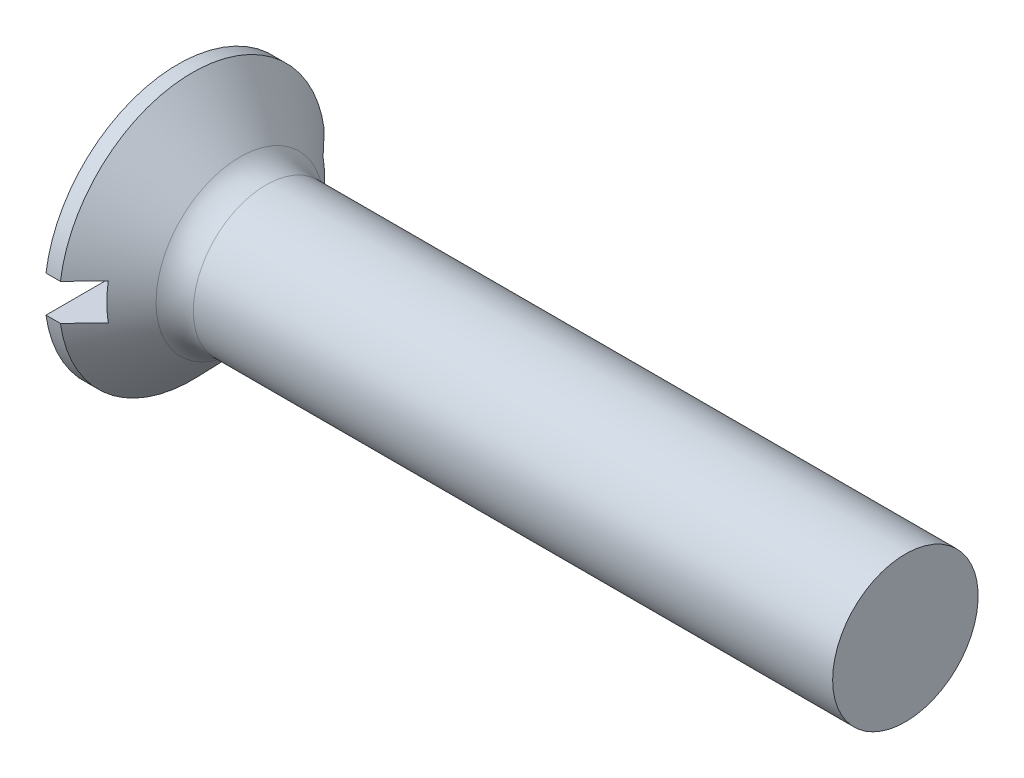
ISO-10303-21;
HEADER;
FILE_DESCRIPTION(('STEP AP214'),'2;1');
FILE_NAME('part.step','',(''),(''),'','','');
FILE_SCHEMA(('AUTOMOTIVE_DESIGN { 1 0 10303 214 1 1 1 1 }'));
ENDSEC;
DATA;
#1=APPLICATION_CONTEXT('core data for automotive mechanical design processes');
#2=APPLICATION_PROTOCOL_DEFINITION('international standard','automotive_design',2000,#1);
#3=PRODUCT_CONTEXT('',#1,'mechanical');
#4=PRODUCT('Part','Part','',(#3));
#5=PRODUCT_RELATED_PRODUCT_CATEGORY('part','',(#4));
#6=PRODUCT_DEFINITION_FORMATION('','',#4);
#7=PRODUCT_DEFINITION_CONTEXT('part definition',#1,'design');
#8=PRODUCT_DEFINITION('design','',#6,#7);
#9=PRODUCT_DEFINITION_SHAPE('','',#8);
#10=(LENGTH_UNIT() NAMED_UNIT(*) SI_UNIT(.MILLI.,.METRE.));
#11=(NAMED_UNIT(*) PLANE_ANGLE_UNIT() SI_UNIT($,.RADIAN.));
#12=(NAMED_UNIT(*) SI_UNIT($,.STERADIAN.) SOLID_ANGLE_UNIT());
#13=UNCERTAINTY_MEASURE_WITH_UNIT(LENGTH_MEASURE(1.E-05),#10,'distance_accuracy_value','');
#14=(GEOMETRIC_REPRESENTATION_CONTEXT(3) GLOBAL_UNCERTAINTY_ASSIGNED_CONTEXT((#13)) GLOBAL_UNIT_ASSIGNED_CONTEXT((#10,
#11,#12)) REPRESENTATION_CONTEXT('',''));
#15=CARTESIAN_POINT('',(0.,0.,0.));
#16=DIRECTION('',(0.,0.,1.));
#17=DIRECTION('',(1.,0.,0.));
#18=AXIS2_PLACEMENT_3D('',#15,#16,#17);
#19=CARTESIAN_POINT('',(0.,0.,0.));
#20=DIRECTION('',(-1.,0.,0.));
#21=DIRECTION('',(0.,0.,1.));
#22=AXIS2_PLACEMENT_3D('',#19,#20,#21);
#23=PLANE('',#22);
#24=DIRECTION('',(0.,0.,-1.));
#25=VECTOR('',#24,1.);
#26=CARTESIAN_POINT('',(0.,1.25,9.15));
#27=LINE('',#26,#25);
#28=CARTESIAN_POINT('',(0.,1.25,9.06421535489973));
#29=VERTEX_POINT('',#28);
#30=CARTESIAN_POINT('',(0.,1.25,-9.06421535489973));
#31=VERTEX_POINT('',#30);
#32=EDGE_CURVE('E173',#29,#31,#27,.T.);
#33=ORIENTED_EDGE('',*,*,#32,.F.);
#34=CARTESIAN_POINT('',(0.,0.,0.));
#35=DIRECTION('',(-1.,0.,0.));
#36=DIRECTION('',(0.,0.,1.));
#37=AXIS2_PLACEMENT_3D('',#34,#35,#36);
#38=CIRCLE('',#37,9.15);
#39=EDGE_CURVE('E116',#29,#31,#38,.T.);
#40=ORIENTED_EDGE('',*,*,#39,.T.);
#41=EDGE_LOOP('',(#33,#40));
#42=FACE_BOUND('',#41,.T.);
#43=ADVANCED_FACE('F34',(#42),#23,.T.);
#44=CARTESIAN_POINT('',(-6.34999999999999,0.,0.));
#45=DIRECTION('',(-1.,0.,0.));
#46=DIRECTION('',(0.,0.,1.));
#47=AXIS2_PLACEMENT_3D('',#44,#45,#46);
#48=CYLINDRICAL_SURFACE('',#47,9.15);
#49=DIRECTION('',(-1.,0.,0.));
#50=VECTOR('',#49,1.);
#51=CARTESIAN_POINT('',(-6.34999999999999,1.25,-9.06421535489973));
#52=LINE('',#51,#50);
#53=CARTESIAN_POINT('',(0.992391584550656,1.25,-9.06421535489973));
#54=VERTEX_POINT('',#53);
#55=EDGE_CURVE('E63',#31,#54,#52,.F.);
#56=ORIENTED_EDGE('',*,*,#55,.F.);
#57=ORIENTED_EDGE('',*,*,#39,.F.);
#58=DIRECTION('',(-1.,0.,0.));
#59=VECTOR('',#58,1.);
#60=CARTESIAN_POINT('',(-6.34999999999999,1.25,9.06421535489973));
#61=LINE('',#60,#59);
#62=CARTESIAN_POINT('',(0.992391584550656,1.25,9.06421535489973));
#63=VERTEX_POINT('',#62);
#64=EDGE_CURVE('E179',#63,#29,#61,.T.);
#65=ORIENTED_EDGE('',*,*,#64,.F.);
#66=CARTESIAN_POINT('',(0.992391584550657,0.,0.));
#67=DIRECTION('',(-1.,0.,0.));
#68=DIRECTION('',(0.,0.,1.));
#69=AXIS2_PLACEMENT_3D('',#66,#67,#68);
#70=CIRCLE('',#69,9.15);
#71=EDGE_CURVE('E110',#63,#54,#70,.T.);
#72=ORIENTED_EDGE('',*,*,#71,.T.);
#73=EDGE_LOOP('',(#56,#57,#65,#72));
#74=FACE_BOUND('',#73,.T.);
#75=ADVANCED_FACE('F157',(#74),#48,.T.);
#76=DIRECTION('',(0.,0.,1.));
#77=VECTOR('',#76,1.);
#78=CARTESIAN_POINT('',(0.,-1.25,-9.15));
#79=LINE('',#78,#77);
#80=CARTESIAN_POINT('',(0.,-1.25,-9.06421535489973));
#81=VERTEX_POINT('',#80);
#82=CARTESIAN_POINT('',(0.,-1.25,9.06421535489973));
#83=VERTEX_POINT('',#82);
#84=EDGE_CURVE('E104',#81,#83,#79,.T.);
#85=ORIENTED_EDGE('',*,*,#84,.F.);
#86=EDGE_CURVE('E112',#81,#83,#38,.T.);
#87=ORIENTED_EDGE('',*,*,#86,.T.);
#88=EDGE_LOOP('',(#85,#87));
#89=FACE_BOUND('',#88,.T.);
#90=ADVANCED_FACE('F159',(#89),#23,.T.);
#91=DIRECTION('',(-1.,0.,0.));
#92=VECTOR('',#91,1.);
#93=CARTESIAN_POINT('',(-6.34999999999999,-1.25,9.06421535489973));
#94=LINE('',#93,#92);
#95=CARTESIAN_POINT('',(0.992391584550656,-1.25,9.06421535489973));
#96=VERTEX_POINT('',#95);
#97=EDGE_CURVE('E178',#83,#96,#94,.F.);
#98=ORIENTED_EDGE('',*,*,#97,.F.);
#99=ORIENTED_EDGE('',*,*,#86,.F.);
#100=DIRECTION('',(-1.,0.,0.));
#101=VECTOR('',#100,1.);
#102=CARTESIAN_POINT('',(-6.34999999999999,-1.25,-9.06421535489973));
#103=LINE('',#102,#101);
#104=CARTESIAN_POINT('',(0.992391584550656,-1.25,-9.06421535489973));
#105=VERTEX_POINT('',#104);
#106=EDGE_CURVE('E176',#105,#81,#103,.T.);
#107=ORIENTED_EDGE('',*,*,#106,.F.);
#108=EDGE_CURVE('E113',#105,#96,#70,.T.);
#109=ORIENTED_EDGE('',*,*,#108,.T.);
#110=EDGE_LOOP('',(#98,#99,#107,#109));
#111=FACE_BOUND('',#110,.T.);
#112=ADVANCED_FACE('F154',(#111),#48,.T.);
#113=CARTESIAN_POINT('',(0.992391584550657,0.,0.));
#114=DIRECTION('',(-1.,0.,0.));
#115=DIRECTION('',(0.,0.,1.));
#116=AXIS2_PLACEMENT_3D('',#113,#114,#115);
#117=CONICAL_SURFACE('',#116,9.15,0.802851455917393);
#118=CARTESIAN_POINT('',(-9.68926312728032,1.25,-20.1724858670183));
#119=CARTESIAN_POINT('',(-9.01424055164112,1.25,-19.4721279592236));
#120=CARTESIAN_POINT('',(-8.33927740927863,1.25,-18.7717127347833));
#121=CARTESIAN_POINT('',(-6.98953385556622,1.25,-17.3706787546421));
#122=CARTESIAN_POINT('',(-6.31475344821607,1.25,-16.6700599950881));
#123=CARTESIAN_POINT('',(-4.96516589363894,1.25,-15.2682460891945));
#124=CARTESIAN_POINT('',(-4.29035886865508,1.25,-14.5670508251462));
#125=CARTESIAN_POINT('',(-2.94117950182108,1.25,-13.1642690748612));
#126=CARTESIAN_POINT('',(-2.26680715158945,1.25,-12.4626825966861));
#127=CARTESIAN_POINT('',(-0.909509733968211,1.25,-11.0492554204983));
#128=CARTESIAN_POINT('',(-0.226593943364663,1.25,-10.3374058084545));
#129=CARTESIAN_POINT('',(0.796845427596413,1.25,-9.26869429632297));
#130=CARTESIAN_POINT('',(1.13784669076939,1.25,-8.91228991291522));
#131=CARTESIAN_POINT('',(1.81938768490097,1.25,-8.19904421131071));
#132=CARTESIAN_POINT('',(2.15992741873953,1.25,-7.8422028958671));
#133=CARTESIAN_POINT('',(2.84022999490203,1.25,-7.12797275646561));
#134=CARTESIAN_POINT('',(3.17999302966198,1.25,-6.77058411583825));
#135=CARTESIAN_POINT('',(3.85846834349407,1.25,-6.05479291252274));
#136=CARTESIAN_POINT('',(4.19718059721083,1.25,-5.69639032576093));
#137=CARTESIAN_POINT('',(4.70385175872086,1.25,-5.15750839589518));
#138=CARTESIAN_POINT('',(4.87250030918234,1.25,-4.97767771293288));
#139=CARTESIAN_POINT('',(5.20915994338906,1.25,-4.61742089709344));
#140=CARTESIAN_POINT('',(5.37717102877544,1.25,-4.4369947657515));
#141=CARTESIAN_POINT('',(5.71228703189576,1.25,-4.07531534884314));
#142=CARTESIAN_POINT('',(5.8793919841947,1.25,-3.89406209532046));
#143=CARTESIAN_POINT('',(6.21227568403779,1.25,-3.53034270795877));
#144=CARTESIAN_POINT('',(6.3780544521326,1.25,-3.34787659299489));
#145=CARTESIAN_POINT('',(6.58515551964639,1.25,-3.1172860724834));
#146=CARTESIAN_POINT('',(6.62745985382636,1.25,-3.07004359786024));
#147=CARTESIAN_POINT('',(6.71190694785612,1.25,-2.97541424402892));
#148=CARTESIAN_POINT('',(6.75404970723616,1.25,-2.92802736440167));
#149=CARTESIAN_POINT('',(6.88020481904699,1.25,-2.78562134546233));
#150=CARTESIAN_POINT('',(6.96394260693287,1.25,-2.69035838008456));
#151=CARTESIAN_POINT('',(7.1304020328392,1.25,-2.49902470390557));
#152=CARTESIAN_POINT('',(7.21312412144395,1.25,-2.4029543856586));
#153=CARTESIAN_POINT('',(7.37722405171027,1.25,-2.20967422347917));
#154=CARTESIAN_POINT('',(7.45860194603245,1.25,-2.11246442444371));
#155=CARTESIAN_POINT('',(7.59838190335501,1.25,-1.94211253661731));
#156=CARTESIAN_POINT('',(7.65722241797433,1.25,-1.8693308977822));
#157=CARTESIAN_POINT('',(7.77348883000972,1.25,-1.72264602388578));
#158=CARTESIAN_POINT('',(7.83091478285918,1.25,-1.64874283295947));
#159=CARTESIAN_POINT('',(7.94389223017008,1.25,-1.49935163111426));
#160=CARTESIAN_POINT('',(7.9994410451595,1.25,-1.42386158519671));
#161=CARTESIAN_POINT('',(8.10773741292563,1.25,-1.27089958556267));
#162=CARTESIAN_POINT('',(8.16048561809728,1.25,-1.19342809970341));
#163=CARTESIAN_POINT('',(8.2441217481958,1.25,-1.06328283518841));
#164=CARTESIAN_POINT('',(8.27621566092871,1.25,-1.0113877581102));
#165=CARTESIAN_POINT('',(8.33803425750759,1.25,-0.90621123616715));
#166=CARTESIAN_POINT('',(8.36775953025512,1.25,-0.852930140297618));
#167=CARTESIAN_POINT('',(8.42399674170305,1.25,-0.744779653885237));
#168=CARTESIAN_POINT('',(8.4505137377604,1.25,-0.689912936568829));
#169=CARTESIAN_POINT('',(8.49926370407369,1.25,-0.578338475250984));
#170=CARTESIAN_POINT('',(8.52149935625715,1.25,-0.521631909959252));
#171=CARTESIAN_POINT('',(8.56630944844457,1.25,-0.388189889330129));
#172=CARTESIAN_POINT('',(8.58683338761993,1.25,-0.310716054923997));
#173=CARTESIAN_POINT('',(8.60761821215468,1.25,-0.192881073158289));
#174=CARTESIAN_POINT('',(8.61287928751607,1.25,-0.153381824760491));
#175=CARTESIAN_POINT('',(8.61981602962899,1.25,-0.0740612328233033));
#176=CARTESIAN_POINT('',(8.62149192381336,1.25,-0.0342399098762053));
#177=CARTESIAN_POINT('',(8.62114932510183,1.25,0.0455181696409681));
#178=CARTESIAN_POINT('',(8.61911849348499,1.25,0.0854548683088154));
#179=CARTESIAN_POINT('',(8.61146403387258,1.25,0.164983943561107));
#180=CARTESIAN_POINT('',(8.60583973991843,1.25,0.204576254943091));
#181=CARTESIAN_POINT('',(8.59129476268395,1.25,0.283243693059932));
#182=CARTESIAN_POINT('',(8.58236590296061,1.25,0.322317285806376));
#183=CARTESIAN_POINT('',(8.56163589771213,1.25,0.39968443869835));
#184=CARTESIAN_POINT('',(8.54983459552043,1.25,0.437977956174113));
#185=CARTESIAN_POINT('',(8.50721080476264,1.25,0.562063269094923));
#186=CARTESIAN_POINT('',(8.47133142703691,1.25,0.64611632875432));
#187=CARTESIAN_POINT('',(8.3915225491542,1.25,0.810325758169366));
#188=CARTESIAN_POINT('',(8.34757602547931,1.25,0.890473425330856));
#189=CARTESIAN_POINT('',(8.25413254409598,1.25,1.04839009260173));
#190=CARTESIAN_POINT('',(8.20458979486385,1.25,1.12613167481966));
#191=CARTESIAN_POINT('',(8.12771236670437,1.25,1.2409397171596));
#192=CARTESIAN_POINT('',(8.10167239289162,1.25,1.27889064025533));
#193=CARTESIAN_POINT('',(8.04887104431016,1.25,1.35428659335601));
#194=CARTESIAN_POINT('',(8.02210969440909,1.25,1.39173164073316));
#195=CARTESIAN_POINT('',(7.93508459655641,1.25,1.51146882819871));
#196=CARTESIAN_POINT('',(7.87365988855097,1.25,1.59291626111059));
#197=CARTESIAN_POINT('',(7.74881393515933,1.25,1.75427079864039));
#198=CARTESIAN_POINT('',(7.685392413867,1.25,1.8341776879152));
#199=CARTESIAN_POINT('',(7.55709587700167,1.25,1.99286763041483));
#200=CARTESIAN_POINT('',(7.49222027211355,1.25,2.07165020600184));
#201=CARTESIAN_POINT('',(7.36141091265732,1.25,2.22833328749162));
#202=CARTESIAN_POINT('',(7.29547712592426,1.25,2.3062337664586));
#203=CARTESIAN_POINT('',(7.09628206971578,1.25,2.53915990728639));
#204=CARTESIAN_POINT('',(6.96182852613734,1.25,2.69316475933354));
#205=CARTESIAN_POINT('',(6.69102699846119,1.25,2.9994210086128));
#206=CARTESIAN_POINT('',(6.55467949381919,1.25,3.15167283239696));
#207=CARTESIAN_POINT('',(6.28142781492387,1.25,3.45421345059476));
#208=CARTESIAN_POINT('',(6.14453041664102,1.25,3.6045083715456));
#209=CARTESIAN_POINT('',(5.86984700634522,1.25,3.90430012594275));
#210=CARTESIAN_POINT('',(5.73206093854199,1.25,4.05379690818392));
#211=CARTESIAN_POINT('',(5.45598064413235,1.25,4.35206183255288));
#212=CARTESIAN_POINT('',(5.31768700990641,1.25,4.50083052338245));
#213=CARTESIAN_POINT('',(5.04062692372921,1.25,4.79792076620431));
#214=CARTESIAN_POINT('',(4.90186048188749,1.25,4.94624232763087));
#215=CARTESIAN_POINT('',(4.4660705823961,1.25,5.41091009955089));
#216=CARTESIAN_POINT('',(4.16840754275882,1.25,5.72665630015931));
#217=CARTESIAN_POINT('',(3.57209808069723,1.25,6.35721911689663));
#218=CARTESIAN_POINT('',(3.27345165518925,1.25,6.67203573010468));
#219=CARTESIAN_POINT('',(2.67550675138375,1.25,7.30105820965693));
#220=CARTESIAN_POINT('',(2.3762082630988,1.25,7.61526406650491));
#221=CARTESIAN_POINT('',(1.77716463889366,1.25,8.24324979686569));
#222=CARTESIAN_POINT('',(1.47741950277228,1.25,8.55702967018651));
#223=CARTESIAN_POINT('',(0.57744252091514,1.25,9.49819852208254));
#224=CARTESIAN_POINT('',(-0.0232625215914238,1.25,10.1251349405784));
#225=CARTESIAN_POINT('',(-1.22537126149238,1.25,11.3783286857159));
#226=CARTESIAN_POINT('',(-1.82677495394723,1.25,12.004586017099));
#227=CARTESIAN_POINT('',(-3.03304692261054,1.25,13.2598195050217));
#228=CARTESIAN_POINT('',(-3.63791742857711,1.25,13.8887935186463));
#229=CARTESIAN_POINT('',(-4.84795516378797,1.25,15.1464588804366));
#230=CARTESIAN_POINT('',(-5.45312239373225,1.25,15.7751502279287));
#231=CARTESIAN_POINT('',(-6.66336846931705,1.25,17.0320308405655));
#232=CARTESIAN_POINT('',(-7.26844721562031,1.25,17.6602202013678));
#233=CARTESIAN_POINT('',(-8.47875515925262,1.25,18.916450932695));
#234=CARTESIAN_POINT('',(-9.08398435619981,1.25,19.5444923035878));
#235=CARTESIAN_POINT('',(-9.68926312728032,1.25,20.1724858670183));
#236=B_SPLINE_CURVE_WITH_KNOTS('',3,(#118,#119,#120,#121,#122,#123,#124,#125,#126,#127,#128,
#129,#130,#131,#132,#133,#134,#135,#136,#137,#138,#139,#140,#141,#142,#143,#144,#145,#146,#147,
#148,#149,#150,#151,#152,#153,#154,#155,#156,#157,#158,#159,#160,#161,#162,#163,#164,#165,#166,
#167,#168,#169,#170,#171,#172,#173,#174,#175,#176,#177,#178,#179,#180,#181,#182,#183,#184,#185,
#186,#187,#188,#189,#190,#191,#192,#193,#194,#195,#196,#197,#198,#199,#200,#201,#202,#203,#204,
#205,#206,#207,#208,#209,#210,#211,#212,#213,#214,#215,#216,#217,#218,#219,#220,#221,#222,#223,
#224,#225,#226,#227,#228,#229,#230,#231,#232,#233,#234,#235),.UNSPECIFIED.,.F.,.F.,(4,2,2,2,2,2,
2,2,2,2,2,2,2,2,2,2,2,2,2,2,2,2,2,2,2,2,2,2,2,2,2,2,2,2,2,2,2,2,2,2,2,2,2,2,2,2,2,2,2,2,2,2,2,2,
2,2,2,2,4),(0.,2.91811758965899,5.8362945861834,8.75577280791459,11.675192942622,
14.634572647173,16.1143539774555,17.5941260309647,19.073479690954,20.5528687743834,
21.2924843440834,22.0320980083599,22.7716832582912,23.5112570252565,23.7015027798315,
23.8917490870786,24.2722479727229,24.6525714746204,25.0328800413254,25.3136423858944,
25.5943937104816,25.8755301730266,26.1566008555931,26.3396067079199,26.522566917643,
26.705234853424,26.8877879870546,27.1271855861973,27.2465897941165,27.3659864271765,
27.4857812254645,27.6055982311715,27.7257137023742,27.8458357262919,28.1192285554659,
28.3932050801582,28.669612738571,28.8076846905895,28.9457518889891,29.2517399455195,
29.5577704685725,29.8639273472216,30.1700935496345,30.7833784354217,31.396510799707,
32.0063949040766,32.6163176767983,33.2256727254458,33.8350148256566,35.1368133641684,
36.4386159887097,37.7404386946759,39.0422619871728,41.6470760006062,44.2518717083811,
46.8697504081776,49.4876353139115,52.1042513165716,54.7208607444798),.UNSPECIFIED.);
#237=CARTESIAN_POINT('',(2.6,1.25,7.38016315458283));
#238=VERTEX_POINT('',#237);
#239=EDGE_CURVE('E11',#238,#63,#236,.T.);
#240=ORIENTED_EDGE('',*,*,#239,.F.);
#241=CARTESIAN_POINT('',(2.6,0.,0.));
#242=DIRECTION('',(1.,0.,0.));
#243=DIRECTION('',(0.,0.,-1.));
#244=AXIS2_PLACEMENT_3D('',#241,#242,#243);
#245=CIRCLE('',#244,7.48527275309738);
#246=CARTESIAN_POINT('',(2.6,-1.25,7.38016315458283));
#247=VERTEX_POINT('',#246);
#248=EDGE_CURVE('E92',#247,#238,#245,.F.);
#249=ORIENTED_EDGE('',*,*,#248,.F.);
#250=CARTESIAN_POINT('',(-9.68926312728032,-1.25,20.1724858670183));
#251=CARTESIAN_POINT('',(-9.01424055164111,-1.25,19.4721279592236));
#252=CARTESIAN_POINT('',(-8.33927740927862,-1.25,18.7717127347833));
#253=CARTESIAN_POINT('',(-6.9895338555662,-1.25,17.3706787546421));
#254=CARTESIAN_POINT('',(-6.31475344821604,-1.25,16.670059995088));
#255=CARTESIAN_POINT('',(-4.9651658936389,-1.25,15.2682460891945));
#256=CARTESIAN_POINT('',(-4.29035886865504,-1.25,14.5670508251461));
#257=CARTESIAN_POINT('',(-2.94117950182102,-1.25,13.1642690748612));
#258=CARTESIAN_POINT('',(-2.26680715158939,-1.25,12.4626825966861));
#259=CARTESIAN_POINT('',(-0.909509733968149,-1.25,11.0492554204982));
#260=CARTESIAN_POINT('',(-0.226593943364607,-1.25,10.3374058084545));
#261=CARTESIAN_POINT('',(0.79684542759646,-1.25,9.26869429632292));
#262=CARTESIAN_POINT('',(1.13784669076943,-1.25,8.91228991291517));
#263=CARTESIAN_POINT('',(1.81938768490101,-1.25,8.19904421131066));
#264=CARTESIAN_POINT('',(2.15992741873956,-1.25,7.84220289586707));
#265=CARTESIAN_POINT('',(2.84022999490206,-1.25,7.12797275646558));
#266=CARTESIAN_POINT('',(3.17999302966201,-1.25,6.77058411583822));
#267=CARTESIAN_POINT('',(3.85846834349409,-1.25,6.05479291252272));
#268=CARTESIAN_POINT('',(4.19718059721084,-1.25,5.69639032576091));
#269=CARTESIAN_POINT('',(4.70385175872087,-1.25,5.15750839589516));
#270=CARTESIAN_POINT('',(4.87250030918235,-1.25,4.97767771293287));
#271=CARTESIAN_POINT('',(5.20915994338906,-1.25,4.61742089709343));
#272=CARTESIAN_POINT('',(5.37717102877545,-1.25,4.4369947657515));
#273=CARTESIAN_POINT('',(5.71228703189576,-1.25,4.07531534884313));
#274=CARTESIAN_POINT('',(5.8793919841947,-1.25,3.89406209532046));
#275=CARTESIAN_POINT('',(6.21227568403779,-1.25,3.53034270795877));
#276=CARTESIAN_POINT('',(6.3780544521326,-1.25,3.34787659299489));
#277=CARTESIAN_POINT('',(6.58515551964639,-1.25,3.1172860724834));
#278=CARTESIAN_POINT('',(6.62745985382636,-1.25,3.07004359786024));
#279=CARTESIAN_POINT('',(6.71190694785612,-1.25,2.97541424402892));
#280=CARTESIAN_POINT('',(6.75404970723616,-1.25,2.92802736440167));
#281=CARTESIAN_POINT('',(6.88020481904699,-1.25,2.78562134546233));
#282=CARTESIAN_POINT('',(6.96394260693287,-1.25,2.69035838008456));
#283=CARTESIAN_POINT('',(7.1304020328392,-1.25,2.49902470390557));
#284=CARTESIAN_POINT('',(7.21312412144395,-1.25,2.4029543856586));
#285=CARTESIAN_POINT('',(7.37722405171027,-1.25,2.20967422347917));
#286=CARTESIAN_POINT('',(7.45860194603245,-1.25,2.11246442444371));
#287=CARTESIAN_POINT('',(7.59838190335501,-1.25,1.94211253661731));
#288=CARTESIAN_POINT('',(7.65722241797432,-1.25,1.8693308977822));
#289=CARTESIAN_POINT('',(7.77348883000972,-1.25,1.72264602388578));
#290=CARTESIAN_POINT('',(7.83091478285918,-1.25,1.64874283295947));
#291=CARTESIAN_POINT('',(7.94389223017008,-1.25,1.49935163111426));
#292=CARTESIAN_POINT('',(7.9994410451595,-1.25,1.42386158519671));
#293=CARTESIAN_POINT('',(8.10773741292563,-1.25,1.27089958556267));
#294=CARTESIAN_POINT('',(8.16048561809728,-1.25,1.1934280997034));
#295=CARTESIAN_POINT('',(8.24412174819579,-1.25,1.06328283518841));
#296=CARTESIAN_POINT('',(8.27621566092871,-1.25,1.0113877581102));
#297=CARTESIAN_POINT('',(8.33803425750758,-1.25,0.906211236167154));
#298=CARTESIAN_POINT('',(8.36775953025512,-1.25,0.852930140297621));
#299=CARTESIAN_POINT('',(8.42399674170305,-1.25,0.744779653885238));
#300=CARTESIAN_POINT('',(8.4505137377604,-1.25,0.689912936568829));
#301=CARTESIAN_POINT('',(8.49926370407369,-1.25,0.578338475250984));
#302=CARTESIAN_POINT('',(8.52149935625715,-1.25,0.521631909959253));
#303=CARTESIAN_POINT('',(8.56630944844457,-1.25,0.388189889330131));
#304=CARTESIAN_POINT('',(8.58683338761994,-1.25,0.310716054924));
#305=CARTESIAN_POINT('',(8.60761821215467,-1.25,0.192881073158293));
#306=CARTESIAN_POINT('',(8.61287928751606,-1.25,0.153381824760495));
#307=CARTESIAN_POINT('',(8.61981602962899,-1.25,0.0740612328233058));
#308=CARTESIAN_POINT('',(8.62149192381336,-1.25,0.0342399098762068));
#309=CARTESIAN_POINT('',(8.62114932510184,-1.25,-0.0455181696409672));
#310=CARTESIAN_POINT('',(8.61911849348499,-1.25,-0.0854548683088142));
#311=CARTESIAN_POINT('',(8.61146403387258,-1.25,-0.164983943561105));
#312=CARTESIAN_POINT('',(8.60583973991843,-1.25,-0.204576254943089));
#313=CARTESIAN_POINT('',(8.59129476268395,-1.25,-0.283243693059931));
#314=CARTESIAN_POINT('',(8.58236590296061,-1.25,-0.322317285806376));
#315=CARTESIAN_POINT('',(8.56163589771213,-1.25,-0.39968443869835));
#316=CARTESIAN_POINT('',(8.54983459552043,-1.25,-0.437977956174113));
#317=CARTESIAN_POINT('',(8.50721080476264,-1.25,-0.562063269094923));
#318=CARTESIAN_POINT('',(8.47133142703691,-1.25,-0.646116328754321));
#319=CARTESIAN_POINT('',(8.3915225491542,-1.25,-0.810325758169367));
#320=CARTESIAN_POINT('',(8.3475760254793,-1.25,-0.890473425330857));
#321=CARTESIAN_POINT('',(8.25413254409598,-1.25,-1.04839009260173));
#322=CARTESIAN_POINT('',(8.20458979486385,-1.25,-1.12613167481966));
#323=CARTESIAN_POINT('',(8.12771236670436,-1.25,-1.2409397171596));
#324=CARTESIAN_POINT('',(8.10167239289162,-1.25,-1.27889064025533));
#325=CARTESIAN_POINT('',(8.04887104431016,-1.25,-1.35428659335601));
#326=CARTESIAN_POINT('',(8.02210969440909,-1.25,-1.39173164073316));
#327=CARTESIAN_POINT('',(7.93508459655641,-1.25,-1.51146882819871));
#328=CARTESIAN_POINT('',(7.87365988855097,-1.25,-1.59291626111059));
#329=CARTESIAN_POINT('',(7.74881393515933,-1.25,-1.75427079864039));
#330=CARTESIAN_POINT('',(7.685392413867,-1.25,-1.8341776879152));
#331=CARTESIAN_POINT('',(7.55709587700167,-1.25,-1.99286763041483));
#332=CARTESIAN_POINT('',(7.49222027211355,-1.25,-2.07165020600184));
#333=CARTESIAN_POINT('',(7.36141091265732,-1.25,-2.22833328749162));
#334=CARTESIAN_POINT('',(7.29547712592426,-1.25,-2.3062337664586));
#335=CARTESIAN_POINT('',(7.09628206971578,-1.25,-2.53915990728639));
#336=CARTESIAN_POINT('',(6.96182852613734,-1.25,-2.69316475933354));
#337=CARTESIAN_POINT('',(6.69102699846119,-1.25,-2.9994210086128));
#338=CARTESIAN_POINT('',(6.55467949381919,-1.25,-3.15167283239696));
#339=CARTESIAN_POINT('',(6.28142781492387,-1.25,-3.45421345059476));
#340=CARTESIAN_POINT('',(6.14453041664102,-1.25,-3.6045083715456));
#341=CARTESIAN_POINT('',(5.86984700634522,-1.25,-3.90430012594275));
#342=CARTESIAN_POINT('',(5.73206093854199,-1.25,-4.05379690818392));
#343=CARTESIAN_POINT('',(5.45598064413235,-1.25,-4.35206183255288));
#344=CARTESIAN_POINT('',(5.31768700990641,-1.25,-4.50083052338245));
#345=CARTESIAN_POINT('',(5.04062692372921,-1.25,-4.79792076620431));
#346=CARTESIAN_POINT('',(4.90186048188749,-1.25,-4.94624232763087));
#347=CARTESIAN_POINT('',(4.4660705823961,-1.25,-5.4109100995509));
#348=CARTESIAN_POINT('',(4.16840754275881,-1.25,-5.72665630015931));
#349=CARTESIAN_POINT('',(3.57209808069722,-1.25,-6.35721911689663));
#350=CARTESIAN_POINT('',(3.27345165518925,-1.25,-6.67203573010469));
#351=CARTESIAN_POINT('',(2.67550675138374,-1.25,-7.30105820965694));
#352=CARTESIAN_POINT('',(2.37620826309879,-1.25,-7.61526406650492));
#353=CARTESIAN_POINT('',(1.77716463889364,-1.25,-8.2432497968657));
#354=CARTESIAN_POINT('',(1.47741950277226,-1.25,-8.55702967018652));
#355=CARTESIAN_POINT('',(0.577442520915122,-1.25,-9.49819852208256));
#356=CARTESIAN_POINT('',(-0.0232625215914414,-1.25,-10.1251349405784));
#357=CARTESIAN_POINT('',(-1.2253712614924,-1.25,-11.3783286857159));
#358=CARTESIAN_POINT('',(-1.82677495394725,-1.25,-12.004586017099));
#359=CARTESIAN_POINT('',(-3.03304692261056,-1.25,-13.2598195050217));
#360=CARTESIAN_POINT('',(-3.63791742857714,-1.25,-13.8887935186463));
#361=CARTESIAN_POINT('',(-4.84795516378798,-1.25,-15.1464588804367));
#362=CARTESIAN_POINT('',(-5.45312239373227,-1.25,-15.7751502279287));
#363=CARTESIAN_POINT('',(-6.66336846931706,-1.25,-17.0320308405655));
#364=CARTESIAN_POINT('',(-7.26844721562032,-1.25,-17.6602202013678));
#365=CARTESIAN_POINT('',(-8.47875515925262,-1.25,-18.9164509326951));
#366=CARTESIAN_POINT('',(-9.08398435619981,-1.25,-19.5444923035878));
#367=CARTESIAN_POINT('',(-9.68926312728032,-1.25,-20.1724858670184));
#368=B_SPLINE_CURVE_WITH_KNOTS('',3,(#250,#251,#252,#253,#254,#255,#256,#257,#258,#259,#260,
#261,#262,#263,#264,#265,#266,#267,#268,#269,#270,#271,#272,#273,#274,#275,#276,#277,#278,#279,
#280,#281,#282,#283,#284,#285,#286,#287,#288,#289,#290,#291,#292,#293,#294,#295,#296,#297,#298,
#299,#300,#301,#302,#303,#304,#305,#306,#307,#308,#309,#310,#311,#312,#313,#314,#315,#316,#317,
#318,#319,#320,#321,#322,#323,#324,#325,#326,#327,#328,#329,#330,#331,#332,#333,#334,#335,#336,
#337,#338,#339,#340,#341,#342,#343,#344,#345,#346,#347,#348,#349,#350,#351,#352,#353,#354,#355,
#356,#357,#358,#359,#360,#361,#362,#363,#364,#365,#366,#367),.UNSPECIFIED.,.F.,.F.,(4,2,2,2,2,2,
2,2,2,2,2,2,2,2,2,2,2,2,2,2,2,2,2,2,2,2,2,2,2,2,2,2,2,2,2,2,2,2,2,2,2,2,2,2,2,2,2,2,2,2,2,2,2,2,
2,2,2,2,4),(0.,2.91811758965902,5.83629458618344,8.75577280791466,11.6751929426221,
14.634572647173,16.1143539774556,17.5941260309648,19.073479690954,20.5528687743834,
21.2924843440834,22.03209800836,22.7716832582912,23.5112570252565,23.7015027798316,
23.8917490870786,24.2722479727229,24.6525714746204,25.0328800413254,25.3136423858944,
25.5943937104816,25.8755301730266,26.1566008555931,26.3396067079199,26.5225669176431,
26.705234853424,26.8877879870546,27.1271855861973,27.2465897941165,27.3659864271765,
27.4857812254645,27.6055982311715,27.7257137023743,27.8458357262919,28.1192285554659,
28.3932050801582,28.669612738571,28.8076846905895,28.9457518889891,29.2517399455195,
29.5577704685725,29.8639273472216,30.1700935496345,30.7833784354217,31.396510799707,
32.0063949040766,32.6163176767983,33.2256727254458,33.8350148256566,35.1368133641684,
36.4386159887097,37.7404386946759,39.0422619871728,41.6470760006062,44.2518717083811,
46.8697504081776,49.4876353139116,52.1042513165717,54.7208607444798),.UNSPECIFIED.);
#369=EDGE_CURVE('E49',#96,#247,#368,.T.);
#370=ORIENTED_EDGE('',*,*,#369,.F.);
#371=ORIENTED_EDGE('',*,*,#108,.F.);
#372=CARTESIAN_POINT('',(2.6,-1.25,-7.38016315458283));
#373=VERTEX_POINT('',#372);
#374=EDGE_CURVE('E128',#373,#105,#368,.T.);
#375=ORIENTED_EDGE('',*,*,#374,.F.);
#376=CARTESIAN_POINT('',(2.6,1.25,-7.38016315458283));
#377=VERTEX_POINT('',#376);
#378=EDGE_CURVE('E100',#377,#373,#245,.F.);
#379=ORIENTED_EDGE('',*,*,#378,.F.);
#380=EDGE_CURVE('E38',#54,#377,#236,.T.);
#381=ORIENTED_EDGE('',*,*,#380,.F.);
#382=ORIENTED_EDGE('',*,*,#71,.F.);
#383=EDGE_LOOP('',(#240,#249,#370,#371,#375,#379,#381,#382));
#384=FACE_BOUND('',#383,.T.);
#385=CARTESIAN_POINT('',(4.26283753967738,0.,0.));
#386=DIRECTION('',(-1.,0.,0.));
#387=DIRECTION('',(0.,0.,1.));
#388=AXIS2_PLACEMENT_3D('',#385,#386,#387);
#389=CIRCLE('',#388,5.76335407385251);
#390=CARTESIAN_POINT('',(4.26283753967738,0.,5.76335407385251));
#391=VERTEX_POINT('',#390);
#392=EDGE_CURVE('E123',#391,#391,#389,.T.);
#393=ORIENTED_EDGE('',*,*,#392,.T.);
#394=EDGE_LOOP('',(#393));
#395=FACE_BOUND('',#394,.T.);
#396=ADVANCED_FACE('F107',(#384,#395),#117,.T.);
#397=CARTESIAN_POINT('',(-6.34999999999999,0.,0.));
#398=DIRECTION('',(-1.,0.,0.));
#399=DIRECTION('',(0.,0.,1.));
#400=AXIS2_PLACEMENT_3D('',#397,#398,#399);
#401=CYLINDRICAL_SURFACE('',#400,5.);
#402=CARTESIAN_POINT('',(6.06118704052402,0.,0.));
#403=DIRECTION('',(-1.,0.,0.));
#404=DIRECTION('',(0.,0.,1.));
#405=AXIS2_PLACEMENT_3D('',#402,#403,#404);
#406=CIRCLE('',#405,5.);
#407=CARTESIAN_POINT('',(6.06118704052402,0.,5.));
#408=VERTEX_POINT('',#407);
#409=EDGE_CURVE('E126',#408,#408,#406,.F.);
#410=ORIENTED_EDGE('',*,*,#409,.T.);
#411=EDGE_LOOP('',(#410));
#412=FACE_BOUND('',#411,.T.);
#413=CARTESIAN_POINT('',(50.,0.,0.));
#414=DIRECTION('',(-1.,0.,0.));
#415=DIRECTION('',(0.,0.,1.));
#416=AXIS2_PLACEMENT_3D('',#413,#414,#415);
#417=CIRCLE('',#416,5.);
#418=CARTESIAN_POINT('',(50.,0.,5.));
#419=VERTEX_POINT('',#418);
#420=EDGE_CURVE('E119',#419,#419,#417,.T.);
#421=ORIENTED_EDGE('',*,*,#420,.T.);
#422=EDGE_LOOP('',(#421));
#423=FACE_BOUND('',#422,.T.);
#424=ADVANCED_FACE('F147',(#412,#423),#401,.T.);
#425=CARTESIAN_POINT('',(50.,5.,0.));
#426=DIRECTION('',(1.,0.,0.));
#427=DIRECTION('',(0.,0.,-1.));
#428=AXIS2_PLACEMENT_3D('',#425,#426,#427);
#429=PLANE('',#428);
#430=ORIENTED_EDGE('',*,*,#420,.F.);
#431=EDGE_LOOP('',(#430));
#432=FACE_BOUND('',#431,.T.);
#433=ADVANCED_FACE('F145',(#432),#429,.T.);
#434=CARTESIAN_POINT('',(6.06118704052402,0.,0.));
#435=DIRECTION('',(-1.,0.,0.));
#436=DIRECTION('',(0.,0.,1.));
#437=AXIS2_PLACEMENT_3D('',#434,#435,#436);
#438=TOROIDAL_SURFACE('',#437,7.5,2.5);
#439=ORIENTED_EDGE('',*,*,#409,.F.);
#440=EDGE_LOOP('',(#439));
#441=FACE_BOUND('',#440,.T.);
#442=ORIENTED_EDGE('',*,*,#392,.F.);
#443=EDGE_LOOP('',(#442));
#444=FACE_BOUND('',#443,.T.);
#445=ADVANCED_FACE('F36',(#441,#444),#438,.F.);
#446=CARTESIAN_POINT('',(2.6,1.25,9.15));
#447=DIRECTION('',(0.,1.,0.));
#448=DIRECTION('',(0.,0.,1.));
#449=AXIS2_PLACEMENT_3D('',#446,#447,#448);
#450=PLANE('',#449);
#451=ORIENTED_EDGE('',*,*,#55,.T.);
#452=ORIENTED_EDGE('',*,*,#380,.T.);
#453=DIRECTION('',(0.,0.,-1.));
#454=VECTOR('',#453,1.);
#455=CARTESIAN_POINT('',(2.6,1.25,9.15));
#456=LINE('',#455,#454);
#457=EDGE_CURVE('E56',#238,#377,#456,.T.);
#458=ORIENTED_EDGE('',*,*,#457,.F.);
#459=ORIENTED_EDGE('',*,*,#239,.T.);
#460=ORIENTED_EDGE('',*,*,#64,.T.);
#461=ORIENTED_EDGE('',*,*,#32,.T.);
#462=EDGE_LOOP('',(#451,#452,#458,#459,#460,#461));
#463=FACE_BOUND('',#462,.T.);
#464=ADVANCED_FACE('F101',(#463),#450,.F.);
#465=CARTESIAN_POINT('',(2.6,-1.25,-9.15));
#466=DIRECTION('',(0.,-1.,0.));
#467=DIRECTION('',(0.,0.,-1.));
#468=AXIS2_PLACEMENT_3D('',#465,#466,#467);
#469=PLANE('',#468);
#470=ORIENTED_EDGE('',*,*,#97,.T.);
#471=ORIENTED_EDGE('',*,*,#369,.T.);
#472=DIRECTION('',(0.,0.,1.));
#473=VECTOR('',#472,1.);
#474=CARTESIAN_POINT('',(2.6,-1.25,-9.15));
#475=LINE('',#474,#473);
#476=EDGE_CURVE('E95',#373,#247,#475,.T.);
#477=ORIENTED_EDGE('',*,*,#476,.F.);
#478=ORIENTED_EDGE('',*,*,#374,.T.);
#479=ORIENTED_EDGE('',*,*,#106,.T.);
#480=ORIENTED_EDGE('',*,*,#84,.T.);
#481=EDGE_LOOP('',(#470,#471,#477,#478,#479,#480));
#482=FACE_BOUND('',#481,.T.);
#483=ADVANCED_FACE('F137',(#482),#469,.F.);
#484=CARTESIAN_POINT('',(2.6,-1.25,-9.15));
#485=DIRECTION('',(1.,0.,0.));
#486=DIRECTION('',(0.,0.,-1.));
#487=AXIS2_PLACEMENT_3D('',#484,#485,#486);
#488=PLANE('',#487);
#489=ORIENTED_EDGE('',*,*,#248,.T.);
#490=ORIENTED_EDGE('',*,*,#457,.T.);
#491=ORIENTED_EDGE('',*,*,#378,.T.);
#492=ORIENTED_EDGE('',*,*,#476,.T.);
#493=EDGE_LOOP('',(#489,#490,#491,#492));
#494=FACE_BOUND('',#493,.T.);
#495=ADVANCED_FACE('F93',(#494),#488,.F.);
#496=CLOSED_SHELL('',(#43,#75,#90,#112,#396,#424,#433,#445,#464,#483,#495));
#497=MANIFOLD_SOLID_BREP('B2',#496);
#498=ADVANCED_BREP_SHAPE_REPRESENTATION('',(#18,#497),#14);
#499=SHAPE_DEFINITION_REPRESENTATION(#9,#498);
ENDSEC;
END-ISO-10303-21;
